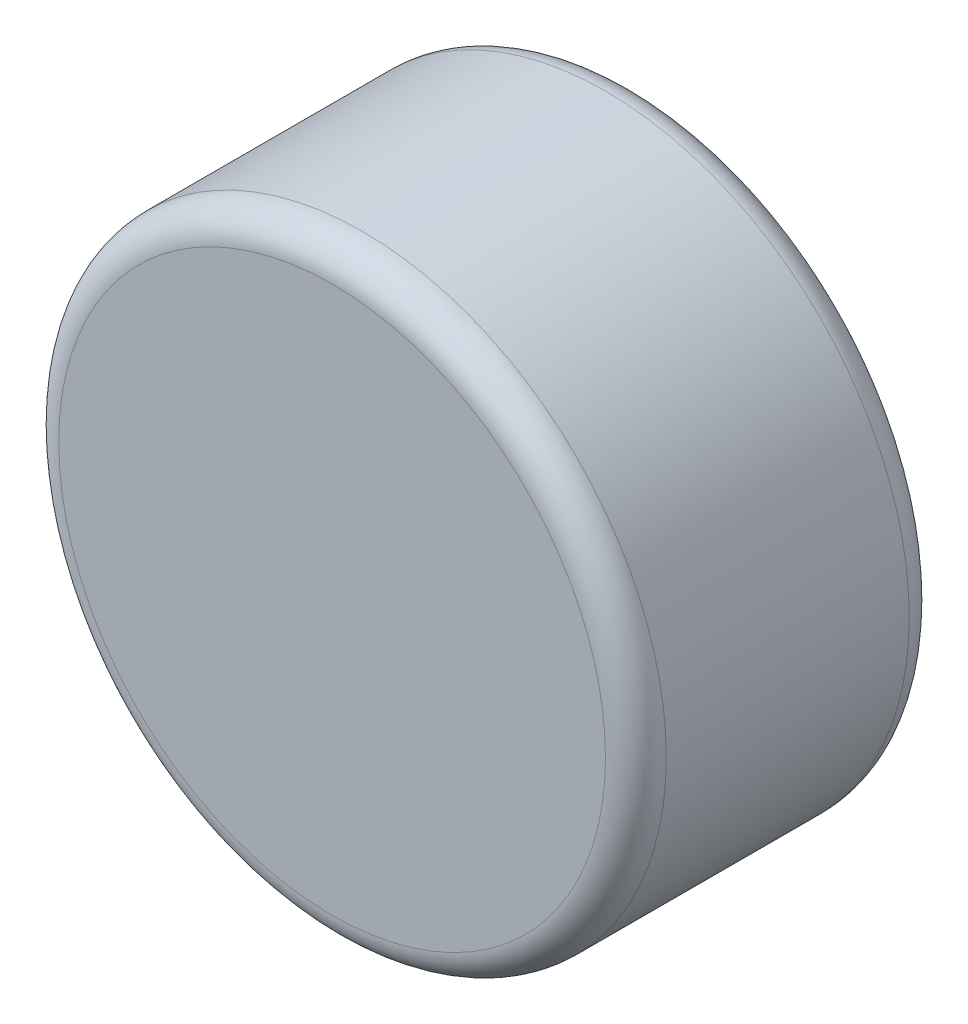
ISO-10303-21;
HEADER;
FILE_DESCRIPTION(('STEP AP214'),'2;1');
FILE_NAME('part.step','',(''),(''),'','','');
FILE_SCHEMA(('AUTOMOTIVE_DESIGN { 1 0 10303 214 1 1 1 1 }'));
ENDSEC;
DATA;
#1=APPLICATION_CONTEXT('core data for automotive mechanical design processes');
#2=APPLICATION_PROTOCOL_DEFINITION('international standard','automotive_design',2000,#1);
#3=PRODUCT_CONTEXT('',#1,'mechanical');
#4=PRODUCT('Part','Part','',(#3));
#5=PRODUCT_RELATED_PRODUCT_CATEGORY('part','',(#4));
#6=PRODUCT_DEFINITION_FORMATION('','',#4);
#7=PRODUCT_DEFINITION_CONTEXT('part definition',#1,'design');
#8=PRODUCT_DEFINITION('design','',#6,#7);
#9=PRODUCT_DEFINITION_SHAPE('','',#8);
#10=(LENGTH_UNIT() NAMED_UNIT(*) SI_UNIT(.MILLI.,.METRE.));
#11=(NAMED_UNIT(*) PLANE_ANGLE_UNIT() SI_UNIT($,.RADIAN.));
#12=(NAMED_UNIT(*) SI_UNIT($,.STERADIAN.) SOLID_ANGLE_UNIT());
#13=UNCERTAINTY_MEASURE_WITH_UNIT(LENGTH_MEASURE(1.E-05),#10,'distance_accuracy_value','');
#14=(GEOMETRIC_REPRESENTATION_CONTEXT(3) GLOBAL_UNCERTAINTY_ASSIGNED_CONTEXT((#13)) GLOBAL_UNIT_ASSIGNED_CONTEXT((#10,
#11,#12)) REPRESENTATION_CONTEXT('',''));
#15=CARTESIAN_POINT('',(0.,0.,0.));
#16=DIRECTION('',(0.,0.,1.));
#17=DIRECTION('',(1.,0.,0.));
#18=AXIS2_PLACEMENT_3D('',#15,#16,#17);
#19=CARTESIAN_POINT('',(0.,0.,2.));
#20=DIRECTION('',(0.,0.,-1.));
#21=DIRECTION('',(-1.,0.,0.));
#22=AXIS2_PLACEMENT_3D('',#19,#20,#21);
#23=CYLINDRICAL_SURFACE('',#22,2.);
#24=CARTESIAN_POINT('',(0.,0.,0.2));
#25=DIRECTION('',(0.,0.,1.));
#26=DIRECTION('',(1.,0.,0.));
#27=AXIS2_PLACEMENT_3D('',#24,#25,#26);
#28=CIRCLE('',#27,2.);
#29=CARTESIAN_POINT('',(2.,0.,0.2));
#30=VERTEX_POINT('',#29);
#31=EDGE_CURVE('E42',#30,#30,#28,.T.);
#32=ORIENTED_EDGE('',*,*,#31,.T.);
#33=EDGE_LOOP('',(#32));
#34=FACE_BOUND('',#33,.T.);
#35=CARTESIAN_POINT('',(0.,0.,1.8));
#36=DIRECTION('',(0.,0.,1.));
#37=DIRECTION('',(1.,0.,0.));
#38=AXIS2_PLACEMENT_3D('',#35,#36,#37);
#39=CIRCLE('',#38,2.);
#40=CARTESIAN_POINT('',(2.,0.,1.8));
#41=VERTEX_POINT('',#40);
#42=EDGE_CURVE('E46',#41,#41,#39,.F.);
#43=ORIENTED_EDGE('',*,*,#42,.T.);
#44=EDGE_LOOP('',(#43));
#45=FACE_BOUND('',#44,.T.);
#46=ADVANCED_FACE('F31',(#34,#45),#23,.T.);
#47=CARTESIAN_POINT('',(0.,0.,2.));
#48=DIRECTION('',(0.,0.,1.));
#49=DIRECTION('',(1.,0.,0.));
#50=AXIS2_PLACEMENT_3D('',#47,#48,#49);
#51=PLANE('',#50);
#52=CARTESIAN_POINT('',(0.,0.,2.));
#53=DIRECTION('',(0.,0.,1.));
#54=DIRECTION('',(1.,0.,0.));
#55=AXIS2_PLACEMENT_3D('',#52,#53,#54);
#56=CIRCLE('',#55,1.8);
#57=CARTESIAN_POINT('',(1.8,0.,2.));
#58=VERTEX_POINT('',#57);
#59=EDGE_CURVE('E10',#58,#58,#56,.T.);
#60=ORIENTED_EDGE('',*,*,#59,.T.);
#61=EDGE_LOOP('',(#60));
#62=FACE_BOUND('',#61,.T.);
#63=ADVANCED_FACE('F62',(#62),#51,.T.);
#64=CARTESIAN_POINT('',(0.,0.,0.));
#65=DIRECTION('',(0.,0.,1.));
#66=DIRECTION('',(1.,0.,0.));
#67=AXIS2_PLACEMENT_3D('',#64,#65,#66);
#68=PLANE('',#67);
#69=CARTESIAN_POINT('',(0.,0.,0.));
#70=DIRECTION('',(0.,0.,1.));
#71=DIRECTION('',(1.,0.,0.));
#72=AXIS2_PLACEMENT_3D('',#69,#70,#71);
#73=CIRCLE('',#72,1.8);
#74=CARTESIAN_POINT('',(1.8,0.,0.));
#75=VERTEX_POINT('',#74);
#76=EDGE_CURVE('E38',#75,#75,#73,.F.);
#77=ORIENTED_EDGE('',*,*,#76,.T.);
#78=EDGE_LOOP('',(#77));
#79=FACE_BOUND('',#78,.T.);
#80=ADVANCED_FACE('F59',(#79),#68,.F.);
#81=CARTESIAN_POINT('',(0.,0.,0.2));
#82=DIRECTION('',(0.,0.,1.));
#83=DIRECTION('',(1.,0.,0.));
#84=AXIS2_PLACEMENT_3D('',#81,#82,#83);
#85=TOROIDAL_SURFACE('',#84,1.8,0.2);
#86=ORIENTED_EDGE('',*,*,#76,.F.);
#87=EDGE_LOOP('',(#86));
#88=FACE_BOUND('',#87,.T.);
#89=ORIENTED_EDGE('',*,*,#31,.F.);
#90=EDGE_LOOP('',(#89));
#91=FACE_BOUND('',#90,.T.);
#92=ADVANCED_FACE('F55',(#88,#91),#85,.T.);
#93=CARTESIAN_POINT('',(0.,0.,1.8));
#94=DIRECTION('',(0.,0.,1.));
#95=DIRECTION('',(1.,0.,0.));
#96=AXIS2_PLACEMENT_3D('',#93,#94,#95);
#97=TOROIDAL_SURFACE('',#96,1.8,0.2);
#98=ORIENTED_EDGE('',*,*,#42,.F.);
#99=EDGE_LOOP('',(#98));
#100=FACE_BOUND('',#99,.T.);
#101=ORIENTED_EDGE('',*,*,#59,.F.);
#102=EDGE_LOOP('',(#101));
#103=FACE_BOUND('',#102,.T.);
#104=ADVANCED_FACE('F33',(#100,#103),#97,.T.);
#105=CLOSED_SHELL('',(#46,#63,#80,#92,#104));
#106=MANIFOLD_SOLID_BREP('B2',#105);
#107=ADVANCED_BREP_SHAPE_REPRESENTATION('',(#18,#106),#14);
#108=SHAPE_DEFINITION_REPRESENTATION(#9,#107);
ENDSEC;
END-ISO-10303-21;
